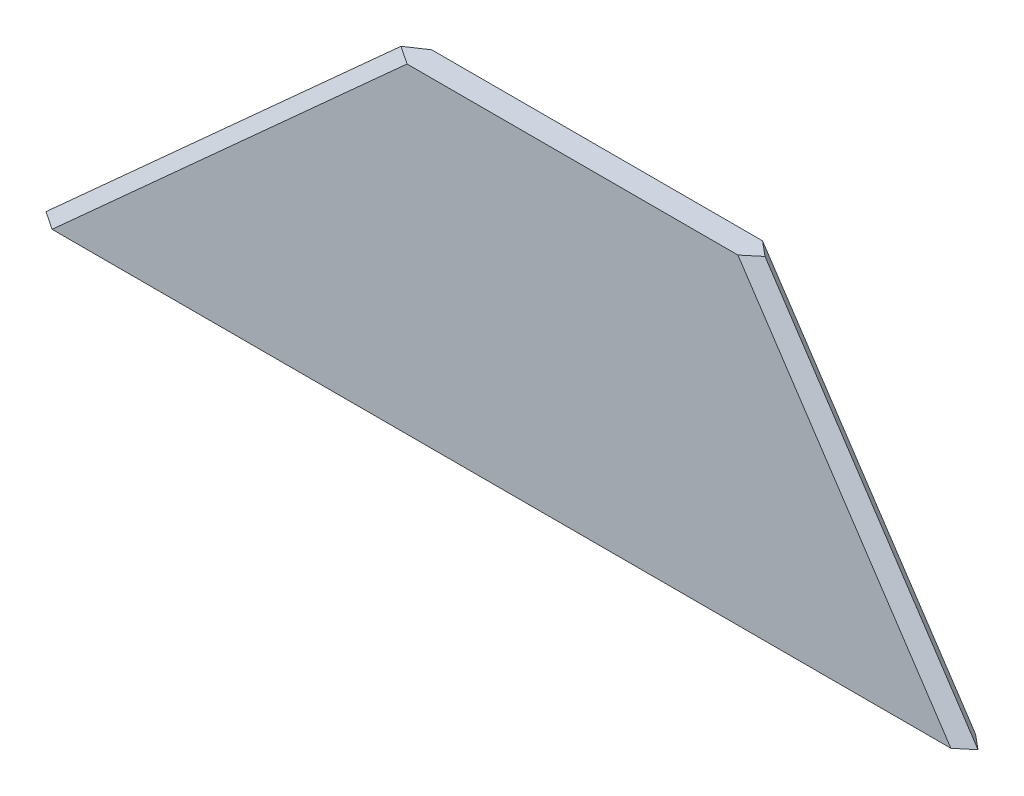
ISO-10303-21;
HEADER;
FILE_DESCRIPTION(('STEP AP214'),'2;1');
FILE_NAME('part.step','',(''),(''),'','','');
FILE_SCHEMA(('AUTOMOTIVE_DESIGN { 1 0 10303 214 1 1 1 1 }'));
ENDSEC;
DATA;
#1=APPLICATION_CONTEXT('core data for automotive mechanical design processes');
#2=APPLICATION_PROTOCOL_DEFINITION('international standard','automotive_design',2000,#1);
#3=PRODUCT_CONTEXT('',#1,'mechanical');
#4=PRODUCT('Part','Part','',(#3));
#5=PRODUCT_RELATED_PRODUCT_CATEGORY('part','',(#4));
#6=PRODUCT_DEFINITION_FORMATION('','',#4);
#7=PRODUCT_DEFINITION_CONTEXT('part definition',#1,'design');
#8=PRODUCT_DEFINITION('design','',#6,#7);
#9=PRODUCT_DEFINITION_SHAPE('','',#8);
#10=(LENGTH_UNIT() NAMED_UNIT(*) SI_UNIT(.MILLI.,.METRE.));
#11=(NAMED_UNIT(*) PLANE_ANGLE_UNIT() SI_UNIT($,.RADIAN.));
#12=(NAMED_UNIT(*) SI_UNIT($,.STERADIAN.) SOLID_ANGLE_UNIT());
#13=UNCERTAINTY_MEASURE_WITH_UNIT(LENGTH_MEASURE(1.E-05),#10,'distance_accuracy_value','');
#14=(GEOMETRIC_REPRESENTATION_CONTEXT(3) GLOBAL_UNCERTAINTY_ASSIGNED_CONTEXT((#13)) GLOBAL_UNIT_ASSIGNED_CONTEXT((#10,
#11,#12)) REPRESENTATION_CONTEXT('',''));
#15=CARTESIAN_POINT('',(0.,0.,0.));
#16=DIRECTION('',(0.,0.,1.));
#17=DIRECTION('',(1.,0.,0.));
#18=AXIS2_PLACEMENT_3D('',#15,#16,#17);
#19=CARTESIAN_POINT('',(0.,0.,5.2832));
#20=DIRECTION('',(0.,1.,0.));
#21=DIRECTION('',(0.,0.,1.));
#22=AXIS2_PLACEMENT_3D('',#19,#20,#21);
#23=PLANE('',#22);
#24=DIRECTION('',(0.768349163952245,0.,0.640030907264552));
#25=VECTOR('',#24,1.);
#26=CARTESIAN_POINT('',(203.2,0.,3.80999999999998));
#27=LINE('',#26,#25);
#28=CARTESIAN_POINT('',(198.626142266833,0.,0.));
#29=VERTEX_POINT('',#28);
#30=CARTESIAN_POINT('',(201.797350295162,0.,2.64159999999998));
#31=VERTEX_POINT('',#30);
#32=EDGE_CURVE('E59',#29,#31,#27,.T.);
#33=ORIENTED_EDGE('',*,*,#32,.T.);
#34=DIRECTION('',(0.76834916395225,0.,-0.640030907264546));
#35=VECTOR('',#34,1.);
#36=CARTESIAN_POINT('',(162.730251940724,0.,35.1842922772549));
#37=LINE('',#36,#35);
#38=CARTESIAN_POINT('',(198.626142266833,0.,5.2832));
#39=VERTEX_POINT('',#38);
#40=EDGE_CURVE('E117',#31,#39,#37,.F.);
#41=ORIENTED_EDGE('',*,*,#40,.T.);
#42=DIRECTION('',(1.,0.,0.));
#43=VECTOR('',#42,1.);
#44=CARTESIAN_POINT('',(0.,0.,5.2832));
#45=LINE('',#44,#43);
#46=CARTESIAN_POINT('',(5.68376600583113,0.,5.2832));
#47=VERTEX_POINT('',#46);
#48=EDGE_CURVE('E109',#47,#39,#45,.T.);
#49=ORIENTED_EDGE('',*,*,#48,.F.);
#50=DIRECTION('',(0.830643124901193,0.,0.556805171540622));
#51=VECTOR('',#50,1.);
#52=CARTESIAN_POINT('',(3.52429867389032,0.,3.83564383279438));
#53=LINE('',#52,#51);
#54=CARTESIAN_POINT('',(1.74302157512156,0.,2.64160000000001));
#55=VERTEX_POINT('',#54);
#56=EDGE_CURVE('E66',#47,#55,#53,.F.);
#57=ORIENTED_EDGE('',*,*,#56,.T.);
#58=DIRECTION('',(0.830643124901193,0.,-0.556805171540621));
#59=VECTOR('',#58,1.);
#60=CARTESIAN_POINT('',(52.5755616720562,0.,-31.4329867389031));
#61=LINE('',#60,#59);
#62=CARTESIAN_POINT('',(5.68376600583115,0.,0.));
#63=VERTEX_POINT('',#62);
#64=EDGE_CURVE('E102',#55,#63,#61,.T.);
#65=ORIENTED_EDGE('',*,*,#64,.T.);
#66=DIRECTION('',(1.,0.,0.));
#67=VECTOR('',#66,1.);
#68=CARTESIAN_POINT('',(0.,0.,0.));
#69=LINE('',#68,#67);
#70=EDGE_CURVE('E125',#63,#29,#69,.T.);
#71=ORIENTED_EDGE('',*,*,#70,.T.);
#72=EDGE_LOOP('',(#33,#41,#49,#57,#65,#71));
#73=FACE_BOUND('',#72,.T.);
#74=ADVANCED_FACE('F40',(#73),#23,.F.);
#75=CARTESIAN_POINT('',(157.48,68.834,5.2832));
#76=DIRECTION('',(0.,-1.,0.));
#77=DIRECTION('',(1.,0.,0.));
#78=AXIS2_PLACEMENT_3D('',#75,#76,#77);
#79=PLANE('',#78);
#80=DIRECTION('',(-1.,0.,0.));
#81=VECTOR('',#80,1.);
#82=CARTESIAN_POINT('',(157.48,68.834,5.2832));
#83=LINE('',#82,#81);
#84=CARTESIAN_POINT('',(152.906142266833,68.834,5.2832));
#85=VERTEX_POINT('',#84);
#86=CARTESIAN_POINT('',(81.8837660058311,68.834,5.2832));
#87=VERTEX_POINT('',#86);
#88=EDGE_CURVE('E112',#85,#87,#83,.T.);
#89=ORIENTED_EDGE('',*,*,#88,.F.);
#90=DIRECTION('',(-0.76834916395225,0.,0.640030907264546));
#91=VECTOR('',#90,1.);
#92=CARTESIAN_POINT('',(144.001531154477,68.834,12.7006953217405));
#93=LINE('',#92,#91);
#94=CARTESIAN_POINT('',(156.077350295162,68.834,2.64159999999998));
#95=VERTEX_POINT('',#94);
#96=EDGE_CURVE('E142',#85,#95,#93,.F.);
#97=ORIENTED_EDGE('',*,*,#96,.T.);
#98=DIRECTION('',(-0.768349163952245,0.,-0.640030907264552));
#99=VECTOR('',#98,1.);
#100=CARTESIAN_POINT('',(184.471279213752,68.834,26.2935969555144));
#101=LINE('',#100,#99);
#102=CARTESIAN_POINT('',(152.906142266833,68.834,0.));
#103=VERTEX_POINT('',#102);
#104=EDGE_CURVE('E139',#95,#103,#101,.T.);
#105=ORIENTED_EDGE('',*,*,#104,.T.);
#106=DIRECTION('',(-1.,0.,0.));
#107=VECTOR('',#106,1.);
#108=CARTESIAN_POINT('',(157.48,68.834,0.));
#109=LINE('',#108,#107);
#110=CARTESIAN_POINT('',(81.8837660058311,68.834,0.));
#111=VERTEX_POINT('',#110);
#112=EDGE_CURVE('E119',#103,#111,#109,.T.);
#113=ORIENTED_EDGE('',*,*,#112,.T.);
#114=DIRECTION('',(-0.830643124901193,0.,0.556805171540621));
#115=VECTOR('',#114,1.);
#116=CARTESIAN_POINT('',(76.2,68.834,3.81000000000001));
#117=LINE('',#116,#115);
#118=CARTESIAN_POINT('',(77.9430215751215,68.834,2.6416));
#119=VERTEX_POINT('',#118);
#120=EDGE_CURVE('E133',#111,#119,#117,.T.);
#121=ORIENTED_EDGE('',*,*,#120,.T.);
#122=DIRECTION('',(-0.830643124901193,0.,-0.556805171540622));
#123=VECTOR('',#122,1.);
#124=CARTESIAN_POINT('',(27.1487370018342,68.8339999999999,-31.4073429061087));
#125=LINE('',#124,#123);
#126=EDGE_CURVE('E136',#119,#87,#125,.F.);
#127=ORIENTED_EDGE('',*,*,#126,.T.);
#128=EDGE_LOOP('',(#89,#97,#105,#113,#121,#127));
#129=FACE_BOUND('',#128,.T.);
#130=ADVANCED_FACE('F163',(#129),#79,.F.);
#131=CARTESIAN_POINT('',(0.,0.,5.2832));
#132=DIRECTION('',(0.,0.,-1.));
#133=DIRECTION('',(-1.,0.,0.));
#134=AXIS2_PLACEMENT_3D('',#131,#132,#133);
#135=PLANE('',#134);
#136=ORIENTED_EDGE('',*,*,#48,.T.);
#137=DIRECTION('',(-0.55328072141864,0.83299486391362,0.));
#138=VECTOR('',#137,1.);
#139=CARTESIAN_POINT('',(137.822795648364,91.5428162978061,5.2832));
#140=LINE('',#139,#138);
#141=EDGE_CURVE('E114',#39,#85,#140,.T.);
#142=ORIENTED_EDGE('',*,*,#141,.T.);
#143=ORIENTED_EDGE('',*,*,#88,.T.);
#144=DIRECTION('',(-0.742062951359138,-0.670330199394422,0.));
#145=VECTOR('',#144,1.);
#146=CARTESIAN_POINT('',(2.55395805969276,-2.82725984467833,5.2832));
#147=LINE('',#146,#145);
#148=EDGE_CURVE('E99',#87,#47,#147,.T.);
#149=ORIENTED_EDGE('',*,*,#148,.T.);
#150=EDGE_LOOP('',(#136,#142,#143,#149));
#151=FACE_BOUND('',#150,.T.);
#152=ADVANCED_FACE('F107',(#151),#135,.F.);
#153=CARTESIAN_POINT('',(0.,0.,0.));
#154=DIRECTION('',(0.,0.,-1.));
#155=DIRECTION('',(-1.,0.,0.));
#156=AXIS2_PLACEMENT_3D('',#153,#154,#155);
#157=PLANE('',#156);
#158=ORIENTED_EDGE('',*,*,#112,.F.);
#159=DIRECTION('',(0.55328072141864,-0.83299486391362,0.));
#160=VECTOR('',#159,1.);
#161=CARTESIAN_POINT('',(200.026289568489,-2.10799954860498,0.));
#162=LINE('',#161,#160);
#163=EDGE_CURVE('E11',#103,#29,#162,.T.);
#164=ORIENTED_EDGE('',*,*,#163,.T.);
#165=ORIENTED_EDGE('',*,*,#70,.F.);
#166=DIRECTION('',(0.742062951359138,0.670330199394422,0.));
#167=VECTOR('',#166,1.);
#168=CARTESIAN_POINT('',(78.7539580596927,66.0067401553217,0.));
#169=LINE('',#168,#167);
#170=EDGE_CURVE('E51',#63,#111,#169,.T.);
#171=ORIENTED_EDGE('',*,*,#170,.T.);
#172=EDGE_LOOP('',(#158,#164,#165,#171));
#173=FACE_BOUND('',#172,.T.);
#174=ADVANCED_FACE('F166',(#173),#157,.T.);
#175=CARTESIAN_POINT('',(203.2,0.,3.80999999999998));
#176=DIRECTION('',(0.589016316966889,0.391228550014908,-0.707106781186543));
#177=DIRECTION('',(0.55328072141864,-0.83299486391362,0.));
#178=AXIS2_PLACEMENT_3D('',#175,#176,#177);
#179=PLANE('',#178);
#180=DIRECTION('',(0.55328072141864,-0.83299486391362,0.));
#181=VECTOR('',#180,1.);
#182=CARTESIAN_POINT('',(140.023234880878,93.0043626515056,2.64159999999999));
#183=LINE('',#182,#181);
#184=EDGE_CURVE('E129',#31,#95,#183,.F.);
#185=ORIENTED_EDGE('',*,*,#184,.F.);
#186=ORIENTED_EDGE('',*,*,#32,.F.);
#187=ORIENTED_EDGE('',*,*,#163,.F.);
#188=ORIENTED_EDGE('',*,*,#104,.F.);
#189=EDGE_LOOP('',(#185,#186,#187,#188));
#190=FACE_BOUND('',#189,.T.);
#191=ADVANCED_FACE('F159',(#190),#179,.T.);
#192=CARTESIAN_POINT('',(137.822795648364,91.5428162978061,5.2832));
#193=DIRECTION('',(-0.589016316966885,-0.391228550014905,-0.707106781186549));
#194=DIRECTION('',(-0.55328072141864,0.83299486391362,0.));
#195=AXIS2_PLACEMENT_3D('',#192,#193,#194);
#196=PLANE('',#195);
#197=ORIENTED_EDGE('',*,*,#40,.F.);
#198=ORIENTED_EDGE('',*,*,#184,.T.);
#199=ORIENTED_EDGE('',*,*,#96,.F.);
#200=ORIENTED_EDGE('',*,*,#141,.F.);
#201=EDGE_LOOP('',(#197,#198,#199,#200));
#202=FACE_BOUND('',#201,.T.);
#203=ADVANCED_FACE('F156',(#202),#196,.F.);
#204=CARTESIAN_POINT('',(76.2,68.834,3.81000000000001));
#205=DIRECTION('',(-0.473995029625926,0.524717744973349,-0.707106781186548));
#206=DIRECTION('',(0.742062951359138,0.670330199394422,0.));
#207=AXIS2_PLACEMENT_3D('',#204,#205,#206);
#208=PLANE('',#207);
#209=DIRECTION('',(0.742062951359138,0.670330199394422,0.));
#210=VECTOR('',#209,1.);
#211=CARTESIAN_POINT('',(0.783213804972455,-0.867026352368031,2.6416));
#212=LINE('',#211,#210);
#213=EDGE_CURVE('E45',#119,#55,#212,.F.);
#214=ORIENTED_EDGE('',*,*,#213,.F.);
#215=ORIENTED_EDGE('',*,*,#120,.F.);
#216=ORIENTED_EDGE('',*,*,#170,.F.);
#217=ORIENTED_EDGE('',*,*,#64,.F.);
#218=EDGE_LOOP('',(#214,#215,#216,#217));
#219=FACE_BOUND('',#218,.T.);
#220=ADVANCED_FACE('F43',(#219),#208,.T.);
#221=CARTESIAN_POINT('',(2.55395805969276,-2.82725984467833,5.2832));
#222=DIRECTION('',(0.473995029625926,-0.52471774497335,-0.707106781186547));
#223=DIRECTION('',(-0.742062951359138,-0.670330199394422,0.));
#224=AXIS2_PLACEMENT_3D('',#221,#222,#223);
#225=PLANE('',#224);
#226=ORIENTED_EDGE('',*,*,#126,.F.);
#227=ORIENTED_EDGE('',*,*,#213,.T.);
#228=ORIENTED_EDGE('',*,*,#56,.F.);
#229=ORIENTED_EDGE('',*,*,#148,.F.);
#230=EDGE_LOOP('',(#226,#227,#228,#229));
#231=FACE_BOUND('',#230,.T.);
#232=ADVANCED_FACE('F98',(#231),#225,.F.);
#233=CLOSED_SHELL('',(#74,#130,#152,#174,#191,#203,#220,#232));
#234=MANIFOLD_SOLID_BREP('B2',#233);
#235=ADVANCED_BREP_SHAPE_REPRESENTATION('',(#18,#234),#14);
#236=SHAPE_DEFINITION_REPRESENTATION(#9,#235);
ENDSEC;
END-ISO-10303-21;
